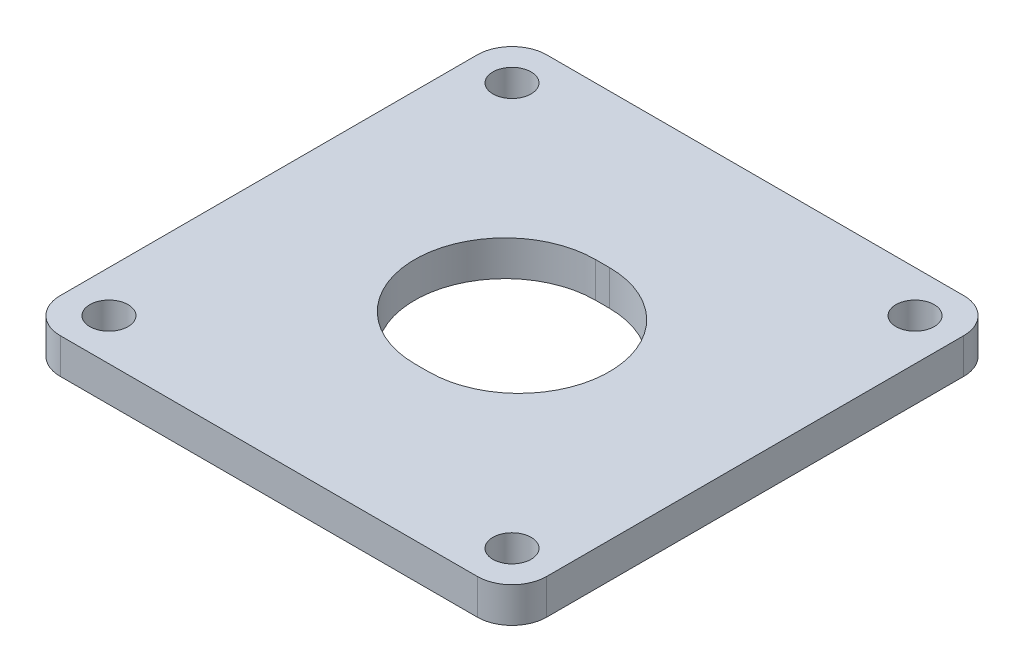
ISO-10303-21;
HEADER;
FILE_DESCRIPTION(('STEP AP214'),'2;1');
FILE_NAME('part.step','',(''),(''),'','','');
FILE_SCHEMA(('AUTOMOTIVE_DESIGN { 1 0 10303 214 1 1 1 1 }'));
ENDSEC;
DATA;
#1=APPLICATION_CONTEXT('core data for automotive mechanical design processes');
#2=APPLICATION_PROTOCOL_DEFINITION('international standard','automotive_design',2000,#1);
#3=PRODUCT_CONTEXT('',#1,'mechanical');
#4=PRODUCT('Part','Part','',(#3));
#5=PRODUCT_RELATED_PRODUCT_CATEGORY('part','',(#4));
#6=PRODUCT_DEFINITION_FORMATION('','',#4);
#7=PRODUCT_DEFINITION_CONTEXT('part definition',#1,'design');
#8=PRODUCT_DEFINITION('design','',#6,#7);
#9=PRODUCT_DEFINITION_SHAPE('','',#8);
#10=(LENGTH_UNIT() NAMED_UNIT(*) SI_UNIT(.MILLI.,.METRE.));
#11=(NAMED_UNIT(*) PLANE_ANGLE_UNIT() SI_UNIT($,.RADIAN.));
#12=(NAMED_UNIT(*) SI_UNIT($,.STERADIAN.) SOLID_ANGLE_UNIT());
#13=UNCERTAINTY_MEASURE_WITH_UNIT(LENGTH_MEASURE(1.E-05),#10,'distance_accuracy_value','');
#14=(GEOMETRIC_REPRESENTATION_CONTEXT(3) GLOBAL_UNCERTAINTY_ASSIGNED_CONTEXT((#13)) GLOBAL_UNIT_ASSIGNED_CONTEXT((#10,
#11,#12)) REPRESENTATION_CONTEXT('',''));
#15=CARTESIAN_POINT('',(0.,0.,0.));
#16=DIRECTION('',(0.,0.,1.));
#17=DIRECTION('',(1.,0.,0.));
#18=AXIS2_PLACEMENT_3D('',#15,#16,#17);
#19=CARTESIAN_POINT('',(0.,5.08,0.));
#20=DIRECTION('',(0.,-1.,0.));
#21=DIRECTION('',(0.,0.,-1.));
#22=AXIS2_PLACEMENT_3D('',#19,#20,#21);
#23=PLANE('',#22);
#24=CARTESIAN_POINT('',(6.00000000000001,5.08,-6.));
#25=DIRECTION('',(0.,1.,0.));
#26=DIRECTION('',(0.,0.,1.));
#27=AXIS2_PLACEMENT_3D('',#24,#25,#26);
#28=CIRCLE('',#27,2.75);
#29=CARTESIAN_POINT('',(6.00000000000001,5.08,-3.25));
#30=VERTEX_POINT('',#29);
#31=EDGE_CURVE('E189',#30,#30,#28,.T.);
#32=ORIENTED_EDGE('',*,*,#31,.F.);
#33=EDGE_LOOP('',(#32));
#34=FACE_BOUND('',#33,.T.);
#35=CARTESIAN_POINT('',(64.,5.08,-6.));
#36=DIRECTION('',(0.,1.,0.));
#37=DIRECTION('',(0.,0.,1.));
#38=AXIS2_PLACEMENT_3D('',#35,#36,#37);
#39=CIRCLE('',#38,2.75000000000001);
#40=CARTESIAN_POINT('',(64.,5.08,-3.24999999999999));
#41=VERTEX_POINT('',#40);
#42=EDGE_CURVE('E197',#41,#41,#39,.T.);
#43=ORIENTED_EDGE('',*,*,#42,.F.);
#44=EDGE_LOOP('',(#43));
#45=FACE_BOUND('',#44,.T.);
#46=CARTESIAN_POINT('',(64.,5.08,-64.));
#47=DIRECTION('',(0.,1.,0.));
#48=DIRECTION('',(0.,0.,1.));
#49=AXIS2_PLACEMENT_3D('',#46,#47,#48);
#50=CIRCLE('',#49,2.75000000000001);
#51=CARTESIAN_POINT('',(64.,5.08,-61.25));
#52=VERTEX_POINT('',#51);
#53=EDGE_CURVE('E205',#52,#52,#50,.T.);
#54=ORIENTED_EDGE('',*,*,#53,.F.);
#55=EDGE_LOOP('',(#54));
#56=FACE_BOUND('',#55,.T.);
#57=CARTESIAN_POINT('',(6.,5.08,-64.));
#58=DIRECTION('',(0.,1.,0.));
#59=DIRECTION('',(0.,0.,1.));
#60=AXIS2_PLACEMENT_3D('',#57,#58,#59);
#61=CIRCLE('',#60,2.75);
#62=CARTESIAN_POINT('',(6.,5.08,-61.25));
#63=VERTEX_POINT('',#62);
#64=EDGE_CURVE('E213',#63,#63,#61,.T.);
#65=ORIENTED_EDGE('',*,*,#64,.F.);
#66=EDGE_LOOP('',(#65));
#67=FACE_BOUND('',#66,.T.);
#68=DIRECTION('',(0.,0.,-1.));
#69=VECTOR('',#68,1.);
#70=CARTESIAN_POINT('',(70.,5.08,0.));
#71=LINE('',#70,#69);
#72=CARTESIAN_POINT('',(70.,5.08,-5.));
#73=VERTEX_POINT('',#72);
#74=CARTESIAN_POINT('',(70.,5.08,-65.));
#75=VERTEX_POINT('',#74);
#76=EDGE_CURVE('E228',#73,#75,#71,.T.);
#77=ORIENTED_EDGE('',*,*,#76,.T.);
#78=CARTESIAN_POINT('',(65.,5.08,-65.));
#79=DIRECTION('',(0.,-1.,0.));
#80=DIRECTION('',(0.,0.,-1.));
#81=AXIS2_PLACEMENT_3D('',#78,#79,#80);
#82=CIRCLE('',#81,5.);
#83=CARTESIAN_POINT('',(65.,5.08,-70.));
#84=VERTEX_POINT('',#83);
#85=EDGE_CURVE('E283',#75,#84,#82,.F.);
#86=ORIENTED_EDGE('',*,*,#85,.T.);
#87=DIRECTION('',(-1.,0.,0.));
#88=VECTOR('',#87,1.);
#89=CARTESIAN_POINT('',(0.,5.08,-70.));
#90=LINE('',#89,#88);
#91=CARTESIAN_POINT('',(5.,5.08,-70.));
#92=VERTEX_POINT('',#91);
#93=EDGE_CURVE('E232',#84,#92,#90,.T.);
#94=ORIENTED_EDGE('',*,*,#93,.T.);
#95=CARTESIAN_POINT('',(5.,5.08,-65.));
#96=DIRECTION('',(0.,-1.,0.));
#97=DIRECTION('',(0.,0.,-1.));
#98=AXIS2_PLACEMENT_3D('',#95,#96,#97);
#99=CIRCLE('',#98,5.);
#100=CARTESIAN_POINT('',(0.,5.08,-65.));
#101=VERTEX_POINT('',#100);
#102=EDGE_CURVE('E280',#92,#101,#99,.F.);
#103=ORIENTED_EDGE('',*,*,#102,.T.);
#104=DIRECTION('',(0.,0.,1.));
#105=VECTOR('',#104,1.);
#106=CARTESIAN_POINT('',(0.,5.08,0.));
#107=LINE('',#106,#105);
#108=CARTESIAN_POINT('',(0.,5.08,-5.));
#109=VERTEX_POINT('',#108);
#110=EDGE_CURVE('E221',#101,#109,#107,.T.);
#111=ORIENTED_EDGE('',*,*,#110,.T.);
#112=CARTESIAN_POINT('',(5.,5.08,-5.));
#113=DIRECTION('',(0.,-1.,0.));
#114=DIRECTION('',(0.,0.,-1.));
#115=AXIS2_PLACEMENT_3D('',#112,#113,#114);
#116=CIRCLE('',#115,5.);
#117=CARTESIAN_POINT('',(5.,5.08,0.));
#118=VERTEX_POINT('',#117);
#119=EDGE_CURVE('E66',#109,#118,#116,.F.);
#120=ORIENTED_EDGE('',*,*,#119,.T.);
#121=DIRECTION('',(1.,0.,0.));
#122=VECTOR('',#121,1.);
#123=CARTESIAN_POINT('',(0.,5.08,0.));
#124=LINE('',#123,#122);
#125=CARTESIAN_POINT('',(65.,5.08,0.));
#126=VERTEX_POINT('',#125);
#127=EDGE_CURVE('E224',#118,#126,#124,.T.);
#128=ORIENTED_EDGE('',*,*,#127,.T.);
#129=CARTESIAN_POINT('',(65.,5.08,-5.));
#130=DIRECTION('',(0.,-1.,0.));
#131=DIRECTION('',(0.,0.,-1.));
#132=AXIS2_PLACEMENT_3D('',#129,#130,#131);
#133=CIRCLE('',#132,5.);
#134=EDGE_CURVE('E277',#126,#73,#133,.F.);
#135=ORIENTED_EDGE('',*,*,#134,.T.);
#136=EDGE_LOOP('',(#77,#86,#94,#103,#111,#120,#128,#135));
#137=FACE_BOUND('',#136,.T.);
#138=CARTESIAN_POINT('',(34.,5.08,-35.));
#139=DIRECTION('',(0.,1.,0.));
#140=DIRECTION('',(0.,0.,1.));
#141=AXIS2_PLACEMENT_3D('',#138,#139,#140);
#142=CIRCLE('',#141,13.);
#143=CARTESIAN_POINT('',(34.,5.08,-48.));
#144=VERTEX_POINT('',#143);
#145=CARTESIAN_POINT('',(34.,5.08,-22.));
#146=VERTEX_POINT('',#145);
#147=EDGE_CURVE('E136',#144,#146,#142,.T.);
#148=ORIENTED_EDGE('',*,*,#147,.F.);
#149=DIRECTION('',(-1.,0.,0.));
#150=VECTOR('',#149,1.);
#151=CARTESIAN_POINT('',(34.,5.08,-48.));
#152=LINE('',#151,#150);
#153=CARTESIAN_POINT('',(36.,5.08,-48.));
#154=VERTEX_POINT('',#153);
#155=EDGE_CURVE('E165',#154,#144,#152,.T.);
#156=ORIENTED_EDGE('',*,*,#155,.F.);
#157=CARTESIAN_POINT('',(36.,5.08,-35.));
#158=DIRECTION('',(0.,1.,0.));
#159=DIRECTION('',(0.,0.,1.));
#160=AXIS2_PLACEMENT_3D('',#157,#158,#159);
#161=CIRCLE('',#160,13.);
#162=CARTESIAN_POINT('',(36.,5.08,-22.));
#163=VERTEX_POINT('',#162);
#164=EDGE_CURVE('E161',#163,#154,#161,.T.);
#165=ORIENTED_EDGE('',*,*,#164,.F.);
#166=DIRECTION('',(1.,0.,0.));
#167=VECTOR('',#166,1.);
#168=CARTESIAN_POINT('',(34.,5.08,-22.));
#169=LINE('',#168,#167);
#170=EDGE_CURVE('E147',#146,#163,#169,.T.);
#171=ORIENTED_EDGE('',*,*,#170,.F.);
#172=EDGE_LOOP('',(#148,#156,#165,#171));
#173=FACE_BOUND('',#172,.T.);
#174=ADVANCED_FACE('F45',(#34,#45,#56,#67,#137,#173),#23,.F.);
#175=CARTESIAN_POINT('',(0.,0.,0.));
#176=DIRECTION('',(0.,-1.,0.));
#177=DIRECTION('',(0.,0.,-1.));
#178=AXIS2_PLACEMENT_3D('',#175,#176,#177);
#179=PLANE('',#178);
#180=CARTESIAN_POINT('',(64.,0.,-6.));
#181=DIRECTION('',(0.,1.,0.));
#182=DIRECTION('',(0.,0.,1.));
#183=AXIS2_PLACEMENT_3D('',#180,#181,#182);
#184=CIRCLE('',#183,2.75000000000001);
#185=CARTESIAN_POINT('',(64.,0.,-3.24999999999999));
#186=VERTEX_POINT('',#185);
#187=EDGE_CURVE('E193',#186,#186,#184,.T.);
#188=ORIENTED_EDGE('',*,*,#187,.T.);
#189=EDGE_LOOP('',(#188));
#190=FACE_BOUND('',#189,.T.);
#191=CARTESIAN_POINT('',(6.,0.,-64.));
#192=DIRECTION('',(0.,1.,0.));
#193=DIRECTION('',(0.,0.,1.));
#194=AXIS2_PLACEMENT_3D('',#191,#192,#193);
#195=CIRCLE('',#194,2.75);
#196=CARTESIAN_POINT('',(6.,0.,-61.25));
#197=VERTEX_POINT('',#196);
#198=EDGE_CURVE('E209',#197,#197,#195,.T.);
#199=ORIENTED_EDGE('',*,*,#198,.T.);
#200=EDGE_LOOP('',(#199));
#201=FACE_BOUND('',#200,.T.);
#202=DIRECTION('',(-1.,0.,0.));
#203=VECTOR('',#202,1.);
#204=CARTESIAN_POINT('',(0.,0.,-70.));
#205=LINE('',#204,#203);
#206=CARTESIAN_POINT('',(65.,0.,-70.));
#207=VERTEX_POINT('',#206);
#208=CARTESIAN_POINT('',(5.,0.,-70.));
#209=VERTEX_POINT('',#208);
#210=EDGE_CURVE('E225',#207,#209,#205,.T.);
#211=ORIENTED_EDGE('',*,*,#210,.F.);
#212=CARTESIAN_POINT('',(65.,0.,-65.));
#213=DIRECTION('',(0.,-1.,0.));
#214=DIRECTION('',(0.,0.,-1.));
#215=AXIS2_PLACEMENT_3D('',#212,#213,#214);
#216=CIRCLE('',#215,5.);
#217=CARTESIAN_POINT('',(70.,0.,-65.));
#218=VERTEX_POINT('',#217);
#219=EDGE_CURVE('E265',#207,#218,#216,.T.);
#220=ORIENTED_EDGE('',*,*,#219,.T.);
#221=DIRECTION('',(0.,0.,-1.));
#222=VECTOR('',#221,1.);
#223=CARTESIAN_POINT('',(70.,0.,0.));
#224=LINE('',#223,#222);
#225=CARTESIAN_POINT('',(70.,0.,-5.));
#226=VERTEX_POINT('',#225);
#227=EDGE_CURVE('E243',#226,#218,#224,.T.);
#228=ORIENTED_EDGE('',*,*,#227,.F.);
#229=CARTESIAN_POINT('',(65.,0.,-5.));
#230=DIRECTION('',(0.,-1.,0.));
#231=DIRECTION('',(0.,0.,-1.));
#232=AXIS2_PLACEMENT_3D('',#229,#230,#231);
#233=CIRCLE('',#232,5.);
#234=CARTESIAN_POINT('',(65.,0.,0.));
#235=VERTEX_POINT('',#234);
#236=EDGE_CURVE('E259',#226,#235,#233,.T.);
#237=ORIENTED_EDGE('',*,*,#236,.T.);
#238=DIRECTION('',(1.,0.,0.));
#239=VECTOR('',#238,1.);
#240=CARTESIAN_POINT('',(0.,0.,0.));
#241=LINE('',#240,#239);
#242=CARTESIAN_POINT('',(5.,0.,0.));
#243=VERTEX_POINT('',#242);
#244=EDGE_CURVE('E240',#243,#235,#241,.T.);
#245=ORIENTED_EDGE('',*,*,#244,.F.);
#246=CARTESIAN_POINT('',(5.,0.,-5.));
#247=DIRECTION('',(0.,-1.,0.));
#248=DIRECTION('',(0.,0.,-1.));
#249=AXIS2_PLACEMENT_3D('',#246,#247,#248);
#250=CIRCLE('',#249,5.);
#251=CARTESIAN_POINT('',(0.,0.,-5.));
#252=VERTEX_POINT('',#251);
#253=EDGE_CURVE('E256',#243,#252,#250,.T.);
#254=ORIENTED_EDGE('',*,*,#253,.T.);
#255=DIRECTION('',(0.,0.,1.));
#256=VECTOR('',#255,1.);
#257=CARTESIAN_POINT('',(0.,0.,0.));
#258=LINE('',#257,#256);
#259=CARTESIAN_POINT('',(0.,0.,-65.));
#260=VERTEX_POINT('',#259);
#261=EDGE_CURVE('E217',#260,#252,#258,.T.);
#262=ORIENTED_EDGE('',*,*,#261,.F.);
#263=CARTESIAN_POINT('',(5.,0.,-65.));
#264=DIRECTION('',(0.,-1.,0.));
#265=DIRECTION('',(0.,0.,-1.));
#266=AXIS2_PLACEMENT_3D('',#263,#264,#265);
#267=CIRCLE('',#266,5.);
#268=EDGE_CURVE('E262',#260,#209,#267,.T.);
#269=ORIENTED_EDGE('',*,*,#268,.T.);
#270=EDGE_LOOP('',(#211,#220,#228,#237,#245,#254,#262,#269));
#271=FACE_BOUND('',#270,.T.);
#272=CARTESIAN_POINT('',(64.,0.,-64.));
#273=DIRECTION('',(0.,1.,0.));
#274=DIRECTION('',(0.,0.,1.));
#275=AXIS2_PLACEMENT_3D('',#272,#273,#274);
#276=CIRCLE('',#275,2.75000000000001);
#277=CARTESIAN_POINT('',(64.,0.,-61.25));
#278=VERTEX_POINT('',#277);
#279=EDGE_CURVE('E201',#278,#278,#276,.T.);
#280=ORIENTED_EDGE('',*,*,#279,.T.);
#281=EDGE_LOOP('',(#280));
#282=FACE_BOUND('',#281,.T.);
#283=CARTESIAN_POINT('',(6.00000000000001,0.,-6.));
#284=DIRECTION('',(0.,1.,0.));
#285=DIRECTION('',(0.,0.,1.));
#286=AXIS2_PLACEMENT_3D('',#283,#284,#285);
#287=CIRCLE('',#286,2.75);
#288=CARTESIAN_POINT('',(6.00000000000001,0.,-3.25));
#289=VERTEX_POINT('',#288);
#290=EDGE_CURVE('E156',#289,#289,#287,.T.);
#291=ORIENTED_EDGE('',*,*,#290,.T.);
#292=EDGE_LOOP('',(#291));
#293=FACE_BOUND('',#292,.T.);
#294=DIRECTION('',(-1.,0.,0.));
#295=VECTOR('',#294,1.);
#296=CARTESIAN_POINT('',(34.,0.,-48.));
#297=LINE('',#296,#295);
#298=CARTESIAN_POINT('',(36.,0.,-48.));
#299=VERTEX_POINT('',#298);
#300=CARTESIAN_POINT('',(34.,0.,-48.));
#301=VERTEX_POINT('',#300);
#302=EDGE_CURVE('E148',#299,#301,#297,.T.);
#303=ORIENTED_EDGE('',*,*,#302,.T.);
#304=CARTESIAN_POINT('',(34.,0.,-35.));
#305=DIRECTION('',(0.,1.,0.));
#306=DIRECTION('',(0.,0.,1.));
#307=AXIS2_PLACEMENT_3D('',#304,#305,#306);
#308=CIRCLE('',#307,13.);
#309=CARTESIAN_POINT('',(34.,0.,-22.));
#310=VERTEX_POINT('',#309);
#311=EDGE_CURVE('E170',#301,#310,#308,.T.);
#312=ORIENTED_EDGE('',*,*,#311,.T.);
#313=DIRECTION('',(1.,0.,0.));
#314=VECTOR('',#313,1.);
#315=CARTESIAN_POINT('',(34.,0.,-22.));
#316=LINE('',#315,#314);
#317=CARTESIAN_POINT('',(36.,0.,-22.));
#318=VERTEX_POINT('',#317);
#319=EDGE_CURVE('E154',#310,#318,#316,.T.);
#320=ORIENTED_EDGE('',*,*,#319,.T.);
#321=CARTESIAN_POINT('',(36.,0.,-35.));
#322=DIRECTION('',(0.,1.,0.));
#323=DIRECTION('',(0.,0.,1.));
#324=AXIS2_PLACEMENT_3D('',#321,#322,#323);
#325=CIRCLE('',#324,13.);
#326=EDGE_CURVE('E175',#318,#299,#325,.T.);
#327=ORIENTED_EDGE('',*,*,#326,.T.);
#328=EDGE_LOOP('',(#303,#312,#320,#327));
#329=FACE_BOUND('',#328,.T.);
#330=ADVANCED_FACE('F300',(#190,#201,#271,#282,#293,#329),#179,.T.);
#331=CARTESIAN_POINT('',(0.,5.08,0.));
#332=DIRECTION('',(1.,0.,0.));
#333=DIRECTION('',(0.,0.,-1.));
#334=AXIS2_PLACEMENT_3D('',#331,#332,#333);
#335=PLANE('',#334);
#336=ORIENTED_EDGE('',*,*,#110,.F.);
#337=DIRECTION('',(0.,-1.,0.));
#338=VECTOR('',#337,1.);
#339=CARTESIAN_POINT('',(0.,5.08,-65.));
#340=LINE('',#339,#338);
#341=EDGE_CURVE('E289',#101,#260,#340,.T.);
#342=ORIENTED_EDGE('',*,*,#341,.T.);
#343=ORIENTED_EDGE('',*,*,#261,.T.);
#344=DIRECTION('',(0.,-1.,0.));
#345=VECTOR('',#344,1.);
#346=CARTESIAN_POINT('',(0.,5.08,-5.));
#347=LINE('',#346,#345);
#348=EDGE_CURVE('E286',#252,#109,#347,.F.);
#349=ORIENTED_EDGE('',*,*,#348,.T.);
#350=EDGE_LOOP('',(#336,#342,#343,#349));
#351=FACE_BOUND('',#350,.T.);
#352=ADVANCED_FACE('F326',(#351),#335,.F.);
#353=CARTESIAN_POINT('',(0.,5.08,0.));
#354=DIRECTION('',(0.,0.,-1.));
#355=DIRECTION('',(-1.,0.,0.));
#356=AXIS2_PLACEMENT_3D('',#353,#354,#355);
#357=PLANE('',#356);
#358=ORIENTED_EDGE('',*,*,#244,.T.);
#359=DIRECTION('',(0.,-1.,0.));
#360=VECTOR('',#359,1.);
#361=CARTESIAN_POINT('',(65.,5.08,0.));
#362=LINE('',#361,#360);
#363=EDGE_CURVE('E11',#235,#126,#362,.F.);
#364=ORIENTED_EDGE('',*,*,#363,.T.);
#365=ORIENTED_EDGE('',*,*,#127,.F.);
#366=DIRECTION('',(0.,-1.,0.));
#367=VECTOR('',#366,1.);
#368=CARTESIAN_POINT('',(5.,5.08,0.));
#369=LINE('',#368,#367);
#370=EDGE_CURVE('E54',#118,#243,#369,.T.);
#371=ORIENTED_EDGE('',*,*,#370,.T.);
#372=EDGE_LOOP('',(#358,#364,#365,#371));
#373=FACE_BOUND('',#372,.T.);
#374=ADVANCED_FACE('F296',(#373),#357,.F.);
#375=CARTESIAN_POINT('',(70.,5.08,0.));
#376=DIRECTION('',(-1.,0.,0.));
#377=DIRECTION('',(0.,0.,1.));
#378=AXIS2_PLACEMENT_3D('',#375,#376,#377);
#379=PLANE('',#378);
#380=ORIENTED_EDGE('',*,*,#227,.T.);
#381=DIRECTION('',(0.,-1.,0.));
#382=VECTOR('',#381,1.);
#383=CARTESIAN_POINT('',(70.,5.08,-65.));
#384=LINE('',#383,#382);
#385=EDGE_CURVE('E272',#218,#75,#384,.F.);
#386=ORIENTED_EDGE('',*,*,#385,.T.);
#387=ORIENTED_EDGE('',*,*,#76,.F.);
#388=DIRECTION('',(0.,-1.,0.));
#389=VECTOR('',#388,1.);
#390=CARTESIAN_POINT('',(70.,5.08,-5.));
#391=LINE('',#390,#389);
#392=EDGE_CURVE('E268',#73,#226,#391,.T.);
#393=ORIENTED_EDGE('',*,*,#392,.T.);
#394=EDGE_LOOP('',(#380,#386,#387,#393));
#395=FACE_BOUND('',#394,.T.);
#396=ADVANCED_FACE('F310',(#395),#379,.F.);
#397=CARTESIAN_POINT('',(0.,5.08,-70.));
#398=DIRECTION('',(0.,0.,1.));
#399=DIRECTION('',(1.,0.,0.));
#400=AXIS2_PLACEMENT_3D('',#397,#398,#399);
#401=PLANE('',#400);
#402=ORIENTED_EDGE('',*,*,#93,.F.);
#403=DIRECTION('',(0.,-1.,0.));
#404=VECTOR('',#403,1.);
#405=CARTESIAN_POINT('',(65.,5.08,-70.));
#406=LINE('',#405,#404);
#407=EDGE_CURVE('E252',#84,#207,#406,.T.);
#408=ORIENTED_EDGE('',*,*,#407,.T.);
#409=ORIENTED_EDGE('',*,*,#210,.T.);
#410=DIRECTION('',(0.,-1.,0.));
#411=VECTOR('',#410,1.);
#412=CARTESIAN_POINT('',(5.,5.08,-70.));
#413=LINE('',#412,#411);
#414=EDGE_CURVE('E236',#209,#92,#413,.F.);
#415=ORIENTED_EDGE('',*,*,#414,.T.);
#416=EDGE_LOOP('',(#402,#408,#409,#415));
#417=FACE_BOUND('',#416,.T.);
#418=ADVANCED_FACE('F318',(#417),#401,.F.);
#419=CARTESIAN_POINT('',(6.,5.08,-64.));
#420=DIRECTION('',(0.,-1.,0.));
#421=DIRECTION('',(0.,0.,-1.));
#422=AXIS2_PLACEMENT_3D('',#419,#420,#421);
#423=CYLINDRICAL_SURFACE('',#422,2.75);
#424=ORIENTED_EDGE('',*,*,#64,.T.);
#425=EDGE_LOOP('',(#424));
#426=FACE_BOUND('',#425,.T.);
#427=ORIENTED_EDGE('',*,*,#198,.F.);
#428=EDGE_LOOP('',(#427));
#429=FACE_BOUND('',#428,.T.);
#430=ADVANCED_FACE('F344',(#426,#429),#423,.F.);
#431=CARTESIAN_POINT('',(64.,5.08,-64.));
#432=DIRECTION('',(0.,-1.,0.));
#433=DIRECTION('',(0.,0.,-1.));
#434=AXIS2_PLACEMENT_3D('',#431,#432,#433);
#435=CYLINDRICAL_SURFACE('',#434,2.75000000000001);
#436=ORIENTED_EDGE('',*,*,#53,.T.);
#437=EDGE_LOOP('',(#436));
#438=FACE_BOUND('',#437,.T.);
#439=ORIENTED_EDGE('',*,*,#279,.F.);
#440=EDGE_LOOP('',(#439));
#441=FACE_BOUND('',#440,.T.);
#442=ADVANCED_FACE('F426',(#438,#441),#435,.F.);
#443=CARTESIAN_POINT('',(64.,5.08,-6.));
#444=DIRECTION('',(0.,-1.,0.));
#445=DIRECTION('',(0.,0.,-1.));
#446=AXIS2_PLACEMENT_3D('',#443,#444,#445);
#447=CYLINDRICAL_SURFACE('',#446,2.75000000000001);
#448=ORIENTED_EDGE('',*,*,#42,.T.);
#449=EDGE_LOOP('',(#448));
#450=FACE_BOUND('',#449,.T.);
#451=ORIENTED_EDGE('',*,*,#187,.F.);
#452=EDGE_LOOP('',(#451));
#453=FACE_BOUND('',#452,.T.);
#454=ADVANCED_FACE('F417',(#450,#453),#447,.F.);
#455=CARTESIAN_POINT('',(6.00000000000001,5.08,-6.));
#456=DIRECTION('',(0.,-1.,0.));
#457=DIRECTION('',(0.,0.,-1.));
#458=AXIS2_PLACEMENT_3D('',#455,#456,#457);
#459=CYLINDRICAL_SURFACE('',#458,2.75);
#460=ORIENTED_EDGE('',*,*,#31,.T.);
#461=EDGE_LOOP('',(#460));
#462=FACE_BOUND('',#461,.T.);
#463=ORIENTED_EDGE('',*,*,#290,.F.);
#464=EDGE_LOOP('',(#463));
#465=FACE_BOUND('',#464,.T.);
#466=ADVANCED_FACE('F409',(#462,#465),#459,.F.);
#467=CARTESIAN_POINT('',(34.,5.08,-35.));
#468=DIRECTION('',(0.,-1.,0.));
#469=DIRECTION('',(0.,0.,-1.));
#470=AXIS2_PLACEMENT_3D('',#467,#468,#469);
#471=CYLINDRICAL_SURFACE('',#470,13.);
#472=ORIENTED_EDGE('',*,*,#311,.F.);
#473=DIRECTION('',(0.,-1.,0.));
#474=VECTOR('',#473,1.);
#475=CARTESIAN_POINT('',(34.,5.08,-48.));
#476=LINE('',#475,#474);
#477=EDGE_CURVE('E142',#144,#301,#476,.T.);
#478=ORIENTED_EDGE('',*,*,#477,.F.);
#479=ORIENTED_EDGE('',*,*,#147,.T.);
#480=DIRECTION('',(0.,-1.,0.));
#481=VECTOR('',#480,1.);
#482=CARTESIAN_POINT('',(34.,5.08,-22.));
#483=LINE('',#482,#481);
#484=EDGE_CURVE('E139',#146,#310,#483,.T.);
#485=ORIENTED_EDGE('',*,*,#484,.T.);
#486=EDGE_LOOP('',(#472,#478,#479,#485));
#487=FACE_BOUND('',#486,.T.);
#488=ADVANCED_FACE('F138',(#487),#471,.F.);
#489=CARTESIAN_POINT('',(34.,5.08,-22.));
#490=DIRECTION('',(0.,0.,-1.));
#491=DIRECTION('',(-1.,0.,0.));
#492=AXIS2_PLACEMENT_3D('',#489,#490,#491);
#493=PLANE('',#492);
#494=ORIENTED_EDGE('',*,*,#319,.F.);
#495=ORIENTED_EDGE('',*,*,#484,.F.);
#496=ORIENTED_EDGE('',*,*,#170,.T.);
#497=DIRECTION('',(0.,-1.,0.));
#498=VECTOR('',#497,1.);
#499=CARTESIAN_POINT('',(36.,5.08,-22.));
#500=LINE('',#499,#498);
#501=EDGE_CURVE('E157',#163,#318,#500,.T.);
#502=ORIENTED_EDGE('',*,*,#501,.T.);
#503=EDGE_LOOP('',(#494,#495,#496,#502));
#504=FACE_BOUND('',#503,.T.);
#505=ADVANCED_FACE('F151',(#504),#493,.T.);
#506=CARTESIAN_POINT('',(36.,5.08,-35.));
#507=DIRECTION('',(0.,-1.,0.));
#508=DIRECTION('',(0.,0.,-1.));
#509=AXIS2_PLACEMENT_3D('',#506,#507,#508);
#510=CYLINDRICAL_SURFACE('',#509,13.);
#511=ORIENTED_EDGE('',*,*,#326,.F.);
#512=ORIENTED_EDGE('',*,*,#501,.F.);
#513=ORIENTED_EDGE('',*,*,#164,.T.);
#514=DIRECTION('',(0.,-1.,0.));
#515=VECTOR('',#514,1.);
#516=CARTESIAN_POINT('',(36.,5.08,-48.));
#517=LINE('',#516,#515);
#518=EDGE_CURVE('E184',#154,#299,#517,.T.);
#519=ORIENTED_EDGE('',*,*,#518,.T.);
#520=EDGE_LOOP('',(#511,#512,#513,#519));
#521=FACE_BOUND('',#520,.T.);
#522=ADVANCED_FACE('F385',(#521),#510,.F.);
#523=CARTESIAN_POINT('',(34.,5.08,-48.));
#524=DIRECTION('',(0.,0.,1.));
#525=DIRECTION('',(1.,0.,0.));
#526=AXIS2_PLACEMENT_3D('',#523,#524,#525);
#527=PLANE('',#526);
#528=ORIENTED_EDGE('',*,*,#302,.F.);
#529=ORIENTED_EDGE('',*,*,#518,.F.);
#530=ORIENTED_EDGE('',*,*,#155,.T.);
#531=ORIENTED_EDGE('',*,*,#477,.T.);
#532=EDGE_LOOP('',(#528,#529,#530,#531));
#533=FACE_BOUND('',#532,.T.);
#534=ADVANCED_FACE('F357',(#533),#527,.T.);
#535=CARTESIAN_POINT('',(65.,5.08,-65.));
#536=DIRECTION('',(0.,-1.,0.));
#537=DIRECTION('',(0.,0.,-1.));
#538=AXIS2_PLACEMENT_3D('',#535,#536,#537);
#539=CYLINDRICAL_SURFACE('',#538,5.);
#540=ORIENTED_EDGE('',*,*,#85,.F.);
#541=ORIENTED_EDGE('',*,*,#385,.F.);
#542=ORIENTED_EDGE('',*,*,#219,.F.);
#543=ORIENTED_EDGE('',*,*,#407,.F.);
#544=EDGE_LOOP('',(#540,#541,#542,#543));
#545=FACE_BOUND('',#544,.T.);
#546=ADVANCED_FACE('F316',(#545),#539,.T.);
#547=CARTESIAN_POINT('',(5.,5.08,-65.));
#548=DIRECTION('',(0.,-1.,0.));
#549=DIRECTION('',(0.,0.,-1.));
#550=AXIS2_PLACEMENT_3D('',#547,#548,#549);
#551=CYLINDRICAL_SURFACE('',#550,5.);
#552=ORIENTED_EDGE('',*,*,#102,.F.);
#553=ORIENTED_EDGE('',*,*,#414,.F.);
#554=ORIENTED_EDGE('',*,*,#268,.F.);
#555=ORIENTED_EDGE('',*,*,#341,.F.);
#556=EDGE_LOOP('',(#552,#553,#554,#555));
#557=FACE_BOUND('',#556,.T.);
#558=ADVANCED_FACE('F323',(#557),#551,.T.);
#559=CARTESIAN_POINT('',(65.,5.08,-5.));
#560=DIRECTION('',(0.,-1.,0.));
#561=DIRECTION('',(0.,0.,-1.));
#562=AXIS2_PLACEMENT_3D('',#559,#560,#561);
#563=CYLINDRICAL_SURFACE('',#562,5.);
#564=ORIENTED_EDGE('',*,*,#134,.F.);
#565=ORIENTED_EDGE('',*,*,#363,.F.);
#566=ORIENTED_EDGE('',*,*,#236,.F.);
#567=ORIENTED_EDGE('',*,*,#392,.F.);
#568=EDGE_LOOP('',(#564,#565,#566,#567));
#569=FACE_BOUND('',#568,.T.);
#570=ADVANCED_FACE('F307',(#569),#563,.T.);
#571=CARTESIAN_POINT('',(5.,5.08,-5.));
#572=DIRECTION('',(0.,-1.,0.));
#573=DIRECTION('',(0.,0.,-1.));
#574=AXIS2_PLACEMENT_3D('',#571,#572,#573);
#575=CYLINDRICAL_SURFACE('',#574,5.);
#576=ORIENTED_EDGE('',*,*,#119,.F.);
#577=ORIENTED_EDGE('',*,*,#348,.F.);
#578=ORIENTED_EDGE('',*,*,#253,.F.);
#579=ORIENTED_EDGE('',*,*,#370,.F.);
#580=EDGE_LOOP('',(#576,#577,#578,#579));
#581=FACE_BOUND('',#580,.T.);
#582=ADVANCED_FACE('F47',(#581),#575,.T.);
#583=CLOSED_SHELL('',(#174,#330,#352,#374,#396,#418,#430,#442,#454,#466,#488,#505,#522,#534,
#546,#558,#570,#582));
#584=MANIFOLD_SOLID_BREP('B2',#583);
#585=ADVANCED_BREP_SHAPE_REPRESENTATION('',(#18,#584),#14);
#586=SHAPE_DEFINITION_REPRESENTATION(#9,#585);
ENDSEC;
END-ISO-10303-21;
